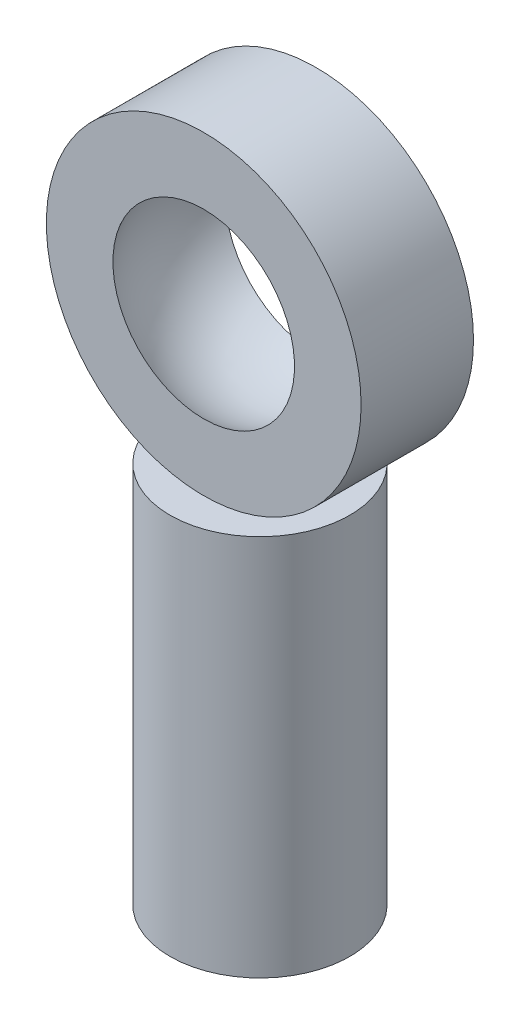
ISO-10303-21;
HEADER;
FILE_DESCRIPTION(('STEP AP214'),'2;1');
FILE_NAME('part.step','',(''),(''),'','','');
FILE_SCHEMA(('AUTOMOTIVE_DESIGN { 1 0 10303 214 1 1 1 1 }'));
ENDSEC;
DATA;
#1=APPLICATION_CONTEXT('core data for automotive mechanical design processes');
#2=APPLICATION_PROTOCOL_DEFINITION('international standard','automotive_design',2000,#1);
#3=PRODUCT_CONTEXT('',#1,'mechanical');
#4=PRODUCT('Part','Part','',(#3));
#5=PRODUCT_RELATED_PRODUCT_CATEGORY('part','',(#4));
#6=PRODUCT_DEFINITION_FORMATION('','',#4);
#7=PRODUCT_DEFINITION_CONTEXT('part definition',#1,'design');
#8=PRODUCT_DEFINITION('design','',#6,#7);
#9=PRODUCT_DEFINITION_SHAPE('','',#8);
#10=(LENGTH_UNIT() NAMED_UNIT(*) SI_UNIT(.MILLI.,.METRE.));
#11=(NAMED_UNIT(*) PLANE_ANGLE_UNIT() SI_UNIT($,.RADIAN.));
#12=(NAMED_UNIT(*) SI_UNIT($,.STERADIAN.) SOLID_ANGLE_UNIT());
#13=UNCERTAINTY_MEASURE_WITH_UNIT(LENGTH_MEASURE(1.E-05),#10,'distance_accuracy_value','');
#14=(GEOMETRIC_REPRESENTATION_CONTEXT(3) GLOBAL_UNCERTAINTY_ASSIGNED_CONTEXT((#13)) GLOBAL_UNIT_ASSIGNED_CONTEXT((#10,
#11,#12)) REPRESENTATION_CONTEXT('',''));
#15=CARTESIAN_POINT('',(0.,0.,0.));
#16=DIRECTION('',(0.,0.,1.));
#17=DIRECTION('',(1.,0.,0.));
#18=AXIS2_PLACEMENT_3D('',#15,#16,#17);
#19=CARTESIAN_POINT('',(0.,-24.,0.));
#20=DIRECTION('',(0.,1.,0.));
#21=DIRECTION('',(0.,0.,1.));
#22=AXIS2_PLACEMENT_3D('',#19,#20,#21);
#23=CYLINDRICAL_SURFACE('',#22,4.);
#24=CARTESIAN_POINT('',(0.,-24.,0.));
#25=DIRECTION('',(0.,1.,0.));
#26=DIRECTION('',(0.,0.,1.));
#27=AXIS2_PLACEMENT_3D('',#24,#25,#26);
#28=CIRCLE('',#27,4.);
#29=CARTESIAN_POINT('',(0.,-24.,4.));
#30=VERTEX_POINT('',#29);
#31=EDGE_CURVE('E11',#30,#30,#28,.T.);
#32=ORIENTED_EDGE('',*,*,#31,.T.);
#33=EDGE_LOOP('',(#32));
#34=FACE_BOUND('',#33,.T.);
#35=CARTESIAN_POINT('',(0.,-7.,0.));
#36=DIRECTION('',(0.,1.,0.));
#37=DIRECTION('',(0.,0.,1.));
#38=AXIS2_PLACEMENT_3D('',#35,#36,#37);
#39=CIRCLE('',#38,4.);
#40=CARTESIAN_POINT('',(0.,-7.,4.));
#41=VERTEX_POINT('',#40);
#42=EDGE_CURVE('E43',#41,#41,#39,.T.);
#43=ORIENTED_EDGE('',*,*,#42,.F.);
#44=EDGE_LOOP('',(#43));
#45=FACE_BOUND('',#44,.T.);
#46=ADVANCED_FACE('F40',(#34,#45),#23,.T.);
#47=CARTESIAN_POINT('',(0.,-24.,0.));
#48=DIRECTION('',(0.,1.,0.));
#49=DIRECTION('',(0.,0.,1.));
#50=AXIS2_PLACEMENT_3D('',#47,#48,#49);
#51=PLANE('',#50);
#52=CARTESIAN_POINT('',(0.,-24.,0.));
#53=DIRECTION('',(0.,-1.,0.));
#54=DIRECTION('',(0.,0.,-1.));
#55=AXIS2_PLACEMENT_3D('',#52,#53,#54);
#56=CIRCLE('',#55,2.);
#57=CARTESIAN_POINT('',(0.,-24.,-2.));
#58=VERTEX_POINT('',#57);
#59=EDGE_CURVE('E52',#58,#58,#56,.T.);
#60=ORIENTED_EDGE('',*,*,#59,.F.);
#61=EDGE_LOOP('',(#60));
#62=FACE_BOUND('',#61,.T.);
#63=ORIENTED_EDGE('',*,*,#31,.F.);
#64=EDGE_LOOP('',(#63));
#65=FACE_BOUND('',#64,.T.);
#66=ADVANCED_FACE('F67',(#62,#65),#51,.F.);
#67=CARTESIAN_POINT('',(0.,-7.,0.));
#68=DIRECTION('',(0.,1.,0.));
#69=DIRECTION('',(0.,0.,1.));
#70=AXIS2_PLACEMENT_3D('',#67,#68,#69);
#71=PLANE('',#70);
#72=ORIENTED_EDGE('',*,*,#42,.T.);
#73=EDGE_LOOP('',(#72));
#74=FACE_BOUND('',#73,.T.);
#75=ADVANCED_FACE('F63',(#74),#71,.T.);
#76=CARTESIAN_POINT('',(0.,-12.,0.));
#77=DIRECTION('',(0.,-1.,0.));
#78=DIRECTION('',(0.,0.,-1.));
#79=AXIS2_PLACEMENT_3D('',#76,#77,#78);
#80=CYLINDRICAL_SURFACE('',#79,2.);
#81=CARTESIAN_POINT('',(0.,-12.,0.));
#82=DIRECTION('',(0.,-1.,0.));
#83=DIRECTION('',(0.,0.,-1.));
#84=AXIS2_PLACEMENT_3D('',#81,#82,#83);
#85=CIRCLE('',#84,2.);
#86=CARTESIAN_POINT('',(0.,-12.,-2.));
#87=VERTEX_POINT('',#86);
#88=EDGE_CURVE('E50',#87,#87,#85,.T.);
#89=ORIENTED_EDGE('',*,*,#88,.F.);
#90=EDGE_LOOP('',(#89));
#91=FACE_BOUND('',#90,.T.);
#92=ORIENTED_EDGE('',*,*,#59,.T.);
#93=EDGE_LOOP('',(#92));
#94=FACE_BOUND('',#93,.T.);
#95=ADVANCED_FACE('F60',(#91,#94),#80,.F.);
#96=CARTESIAN_POINT('',(0.,-12.,0.));
#97=DIRECTION('',(0.,-1.,0.));
#98=DIRECTION('',(0.,0.,-1.));
#99=AXIS2_PLACEMENT_3D('',#96,#97,#98);
#100=PLANE('',#99);
#101=ORIENTED_EDGE('',*,*,#88,.T.);
#102=EDGE_LOOP('',(#101));
#103=FACE_BOUND('',#102,.T.);
#104=ADVANCED_FACE('F58',(#103),#100,.T.);
#105=CLOSED_SHELL('',(#46,#66,#75,#95,#104));
#106=MANIFOLD_SOLID_BREP('B2',#105);
#107=CARTESIAN_POINT('',(0.,0.,-2.5));
#108=DIRECTION('',(0.,0.,1.));
#109=DIRECTION('',(1.,0.,0.));
#110=AXIS2_PLACEMENT_3D('',#107,#108,#109);
#111=CYLINDRICAL_SURFACE('',#110,7.);
#112=CARTESIAN_POINT('',(0.,0.,-2.5));
#113=DIRECTION('',(0.,0.,1.));
#114=DIRECTION('',(1.,0.,0.));
#115=AXIS2_PLACEMENT_3D('',#112,#113,#114);
#116=CIRCLE('',#115,7.);
#117=CARTESIAN_POINT('',(7.,0.,-2.5));
#118=VERTEX_POINT('',#117);
#119=EDGE_CURVE('E39',#118,#118,#116,.T.);
#120=ORIENTED_EDGE('',*,*,#119,.T.);
#121=EDGE_LOOP('',(#120));
#122=FACE_BOUND('',#121,.T.);
#123=CARTESIAN_POINT('',(0.,0.,2.5));
#124=DIRECTION('',(0.,0.,1.));
#125=DIRECTION('',(1.,0.,0.));
#126=AXIS2_PLACEMENT_3D('',#123,#124,#125);
#127=CIRCLE('',#126,7.);
#128=CARTESIAN_POINT('',(7.,0.,2.5));
#129=VERTEX_POINT('',#128);
#130=EDGE_CURVE('E117',#129,#129,#127,.T.);
#131=ORIENTED_EDGE('',*,*,#130,.F.);
#132=EDGE_LOOP('',(#131));
#133=FACE_BOUND('',#132,.T.);
#134=ADVANCED_FACE('F110',(#122,#133),#111,.T.);
#135=CARTESIAN_POINT('',(0.,0.,-2.5));
#136=DIRECTION('',(0.,0.,1.));
#137=DIRECTION('',(1.,0.,0.));
#138=AXIS2_PLACEMENT_3D('',#135,#136,#137);
#139=PLANE('',#138);
#140=CARTESIAN_POINT('',(0.,0.,-2.5));
#141=DIRECTION('',(0.,0.,1.));
#142=DIRECTION('',(1.,0.,0.));
#143=AXIS2_PLACEMENT_3D('',#140,#141,#142);
#144=CIRCLE('',#143,4.03887360535088);
#145=CARTESIAN_POINT('',(0.,4.03887360535088,-2.5));
#146=VERTEX_POINT('',#145);
#147=EDGE_CURVE('E121',#146,#146,#144,.F.);
#148=ORIENTED_EDGE('',*,*,#147,.F.);
#149=EDGE_LOOP('',(#148));
#150=FACE_BOUND('',#149,.T.);
#151=ORIENTED_EDGE('',*,*,#119,.F.);
#152=EDGE_LOOP('',(#151));
#153=FACE_BOUND('',#152,.T.);
#154=ADVANCED_FACE('F139',(#150,#153),#139,.F.);
#155=CARTESIAN_POINT('',(0.,0.,2.5));
#156=DIRECTION('',(0.,0.,1.));
#157=DIRECTION('',(1.,0.,0.));
#158=AXIS2_PLACEMENT_3D('',#155,#156,#157);
#159=PLANE('',#158);
#160=CARTESIAN_POINT('',(0.,0.,2.5));
#161=DIRECTION('',(0.,0.,1.));
#162=DIRECTION('',(1.,0.,0.));
#163=AXIS2_PLACEMENT_3D('',#160,#161,#162);
#164=CIRCLE('',#163,4.03887360535088);
#165=CARTESIAN_POINT('',(0.,4.03887360535088,2.5));
#166=VERTEX_POINT('',#165);
#167=EDGE_CURVE('E113',#166,#166,#164,.F.);
#168=ORIENTED_EDGE('',*,*,#167,.T.);
#169=EDGE_LOOP('',(#168));
#170=FACE_BOUND('',#169,.T.);
#171=ORIENTED_EDGE('',*,*,#130,.T.);
#172=EDGE_LOOP('',(#171));
#173=FACE_BOUND('',#172,.T.);
#174=ADVANCED_FACE('F130',(#170,#173),#159,.T.);
#175=CARTESIAN_POINT('',(0.,0.,0.));
#176=DIRECTION('',(0.,0.,1.));
#177=DIRECTION('',(0.,1.,0.));
#178=AXIS2_PLACEMENT_3D('',#175,#176,#177);
#179=SPHERICAL_SURFACE('',#178,4.75);
#180=CARTESIAN_POINT('',(0.,4.03887360535088,2.5));
#181=CARTESIAN_POINT('',(0.,4.06774176436828,2.45336283921532));
#182=CARTESIAN_POINT('',(0.,4.09580143610749,2.40622526625303));
#183=CARTESIAN_POINT('',(0.,4.15027169669722,2.31100674928705));
#184=CARTESIAN_POINT('',(0.,4.17668228554774,2.26292580528336));
#185=CARTESIAN_POINT('',(0.,4.2278222720278,2.16587799954838));
#186=CARTESIAN_POINT('',(0.,4.25255166965734,2.11691113781709));
#187=CARTESIAN_POINT('',(0.,4.30029971283362,2.01815031626344));
#188=CARTESIAN_POINT('',(0.,4.32331835838036,1.96835635644109));
#189=CARTESIAN_POINT('',(0.,4.36761724720049,1.8680010695096));
#190=CARTESIAN_POINT('',(0.,4.38889749047389,1.81743974240046));
#191=CARTESIAN_POINT('',(0.,4.42969404853969,1.71561039424325));
#192=CARTESIAN_POINT('',(0.,4.44921036333209,1.66434237319519));
#193=CARTESIAN_POINT('',(0.,4.48645564457338,1.56116115263804));
#194=CARTESIAN_POINT('',(0.,4.50418461102227,1.50924795312895));
#195=CARTESIAN_POINT('',(0.,4.53783392309377,1.40483866684341));
#196=CARTESIAN_POINT('',(0.,4.55375426871638,1.35234258006696));
#197=CARTESIAN_POINT('',(0.,4.58376723609187,1.24683050943029));
#198=CARTESIAN_POINT('',(0.,4.59785985784474,1.19381452557007));
#199=CARTESIAN_POINT('',(0.,4.62420046772696,1.08732627488838));
#200=CARTESIAN_POINT('',(0.,4.63644845585631,1.0338540080669));
#201=CARTESIAN_POINT('',(0.,4.65908510206865,0.926517353050928));
#202=CARTESIAN_POINT('',(0.,4.66947376015163,0.872652964856435));
#203=CARTESIAN_POINT('',(0.,4.68837928088032,0.764596699198801));
#204=CARTESIAN_POINT('',(0.,4.69689614352603,0.710404821735659));
#205=CARTESIAN_POINT('',(0.,4.71204785396057,0.601758602598666));
#206=CARTESIAN_POINT('',(0.,4.71868270174941,0.547304260924814));
#207=CARTESIAN_POINT('',(0.,4.73006242128907,0.43819845335681));
#208=CARTESIAN_POINT('',(0.,4.73480729303989,0.383546987462657));
#209=CARTESIAN_POINT('',(0.,4.74240136711218,0.274112507974477));
#210=CARTESIAN_POINT('',(0.,4.74525056943364,0.219329494380449));
#211=CARTESIAN_POINT('',(0.,4.74904988587755,0.109697653857614));
#212=CARTESIAN_POINT('',(0.,4.75,0.054848826928807));
#213=CARTESIAN_POINT('',(0.,4.75,-0.054848826928807));
#214=CARTESIAN_POINT('',(0.,4.74904988587755,-0.109697653857614));
#215=CARTESIAN_POINT('',(0.,4.74525056943364,-0.219329494380449));
#216=CARTESIAN_POINT('',(0.,4.74240136711218,-0.274112507974477));
#217=CARTESIAN_POINT('',(0.,4.73480729303989,-0.383546987462657));
#218=CARTESIAN_POINT('',(0.,4.73006242128907,-0.438198453356809));
#219=CARTESIAN_POINT('',(0.,4.71868270174941,-0.547304260924814));
#220=CARTESIAN_POINT('',(0.,4.71204785396057,-0.601758602598666));
#221=CARTESIAN_POINT('',(0.,4.69689614352603,-0.710404821735659));
#222=CARTESIAN_POINT('',(0.,4.68837928088032,-0.764596699198801));
#223=CARTESIAN_POINT('',(0.,4.66947376015163,-0.872652964856435));
#224=CARTESIAN_POINT('',(0.,4.65908510206865,-0.926517353050928));
#225=CARTESIAN_POINT('',(0.,4.63644845585631,-1.0338540080669));
#226=CARTESIAN_POINT('',(0.,4.62420046772696,-1.08732627488838));
#227=CARTESIAN_POINT('',(0.,4.59785985784474,-1.19381452557007));
#228=CARTESIAN_POINT('',(0.,4.58376723609187,-1.24683050943029));
#229=CARTESIAN_POINT('',(0.,4.55375426871638,-1.35234258006696));
#230=CARTESIAN_POINT('',(0.,4.53783392309377,-1.40483866684341));
#231=CARTESIAN_POINT('',(0.,4.50418461102227,-1.50924795312895));
#232=CARTESIAN_POINT('',(0.,4.48645564457338,-1.56116115263804));
#233=CARTESIAN_POINT('',(0.,4.44921036333209,-1.66434237319519));
#234=CARTESIAN_POINT('',(0.,4.42969404853969,-1.71561039424325));
#235=CARTESIAN_POINT('',(0.,4.38889749047389,-1.81743974240046));
#236=CARTESIAN_POINT('',(0.,4.36761724720049,-1.8680010695096));
#237=CARTESIAN_POINT('',(0.,4.32331835838036,-1.96835635644109));
#238=CARTESIAN_POINT('',(0.,4.30029971283362,-2.01815031626344));
#239=CARTESIAN_POINT('',(0.,4.25255166965734,-2.11691113781709));
#240=CARTESIAN_POINT('',(0.,4.2278222720278,-2.16587799954838));
#241=CARTESIAN_POINT('',(0.,4.17668228554774,-2.26292580528336));
#242=CARTESIAN_POINT('',(0.,4.15027169669722,-2.31100674928705));
#243=CARTESIAN_POINT('',(0.,4.09580143610749,-2.40622526625303));
#244=CARTESIAN_POINT('',(0.,4.06774176436828,-2.45336283921532));
#245=CARTESIAN_POINT('',(0.,4.03887360535088,-2.5));
#246=B_SPLINE_CURVE_WITH_KNOTS('',3,(#180,#181,#182,#183,#184,#185,#186,#187,#188,#189,#190,
#191,#192,#193,#194,#195,#196,#197,#198,#199,#200,#201,#202,#203,#204,#205,#206,#207,#208,#209,
#210,#211,#212,#213,#214,#215,#216,#217,#218,#219,#220,#221,#222,#223,#224,#225,#226,#227,#228,
#229,#230,#231,#232,#233,#234,#235,#236,#237,#238,#239,#240,#241,#242,#243,#244,#245),
.UNSPECIFIED.,.F.,.F.,(4,2,2,2,2,2,2,2,2,2,2,2,2,2,2,2,2,2,2,2,2,2,2,2,2,2,2,2,2,2,2,2,4),(0.,
0.164538254736803,0.329076509473606,0.493614764210409,0.658153018947211,0.822691273684014,
0.987229528420817,1.15176778315762,1.31630603789442,1.48084429263123,1.64538254736803,
1.80992080210483,1.97445905684163,2.13899731157844,2.30353556631524,2.46807382105204,
2.63261207578884,2.79715033052565,2.96168858526245,3.12622683999925,3.29076509473606,
3.45530334947286,3.61984160420966,3.78437985894647,3.94891811368327,4.11345636842007,
4.27799462315687,4.44253287789368,4.60707113263048,4.77160938736728,4.93614764210409,
5.10068589684089,5.26522415157769),.UNSPECIFIED.);
#247=EDGE_CURVE('BSEAM133',#166,#146,#246,.T.);
#248=ORIENTED_EDGE('',*,*,#167,.F.);
#249=ORIENTED_EDGE('',*,*,#147,.T.);
#250=ORIENTED_EDGE('',*,*,#247,.T.);
#251=ORIENTED_EDGE('',*,*,#247,.F.);
#252=EDGE_LOOP('',(#248,#250,#249,#251));
#253=FACE_BOUND('',#252,.T.);
#254=ADVANCED_FACE('F133',(#253),#179,.F.);
#255=CLOSED_SHELL('',(#134,#154,#174,#254));
#256=MANIFOLD_SOLID_BREP('B6',#255);
#257=ADVANCED_BREP_SHAPE_REPRESENTATION('',(#18,#106,#256),#14);
#258=SHAPE_DEFINITION_REPRESENTATION(#9,#257);
ENDSEC;
END-ISO-10303-21;
